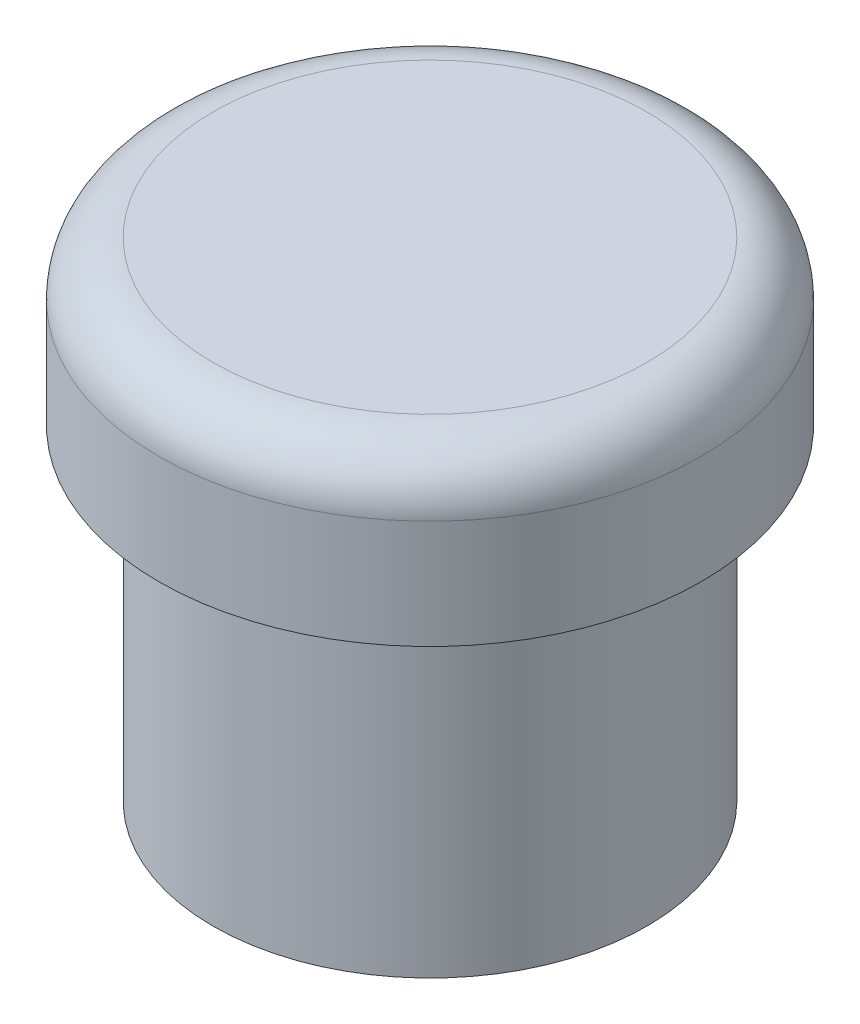
ISO-10303-21;
HEADER;
FILE_DESCRIPTION(('STEP AP214'),'2;1');
FILE_NAME('part.step','',(''),(''),'','','');
FILE_SCHEMA(('AUTOMOTIVE_DESIGN { 1 0 10303 214 1 1 1 1 }'));
ENDSEC;
DATA;
#1=APPLICATION_CONTEXT('core data for automotive mechanical design processes');
#2=APPLICATION_PROTOCOL_DEFINITION('international standard','automotive_design',2000,#1);
#3=PRODUCT_CONTEXT('',#1,'mechanical');
#4=PRODUCT('Part','Part','',(#3));
#5=PRODUCT_RELATED_PRODUCT_CATEGORY('part','',(#4));
#6=PRODUCT_DEFINITION_FORMATION('','',#4);
#7=PRODUCT_DEFINITION_CONTEXT('part definition',#1,'design');
#8=PRODUCT_DEFINITION('design','',#6,#7);
#9=PRODUCT_DEFINITION_SHAPE('','',#8);
#10=(LENGTH_UNIT() NAMED_UNIT(*) SI_UNIT(.MILLI.,.METRE.));
#11=(NAMED_UNIT(*) PLANE_ANGLE_UNIT() SI_UNIT($,.RADIAN.));
#12=(NAMED_UNIT(*) SI_UNIT($,.STERADIAN.) SOLID_ANGLE_UNIT());
#13=UNCERTAINTY_MEASURE_WITH_UNIT(LENGTH_MEASURE(1.E-05),#10,'distance_accuracy_value','');
#14=(GEOMETRIC_REPRESENTATION_CONTEXT(3) GLOBAL_UNCERTAINTY_ASSIGNED_CONTEXT((#13)) GLOBAL_UNIT_ASSIGNED_CONTEXT((#10,
#11,#12)) REPRESENTATION_CONTEXT('',''));
#15=CARTESIAN_POINT('',(0.,0.,0.));
#16=DIRECTION('',(0.,0.,1.));
#17=DIRECTION('',(1.,0.,0.));
#18=AXIS2_PLACEMENT_3D('',#15,#16,#17);
#19=CARTESIAN_POINT('',(0.,0.,0.));
#20=DIRECTION('',(0.,1.,0.));
#21=DIRECTION('',(0.,0.,1.));
#22=AXIS2_PLACEMENT_3D('',#19,#20,#21);
#23=PLANE('',#22);
#24=CARTESIAN_POINT('',(0.,0.,0.));
#25=DIRECTION('',(0.,1.,0.));
#26=DIRECTION('',(0.,0.,1.));
#27=AXIS2_PLACEMENT_3D('',#24,#25,#26);
#28=CIRCLE('',#27,2.);
#29=CARTESIAN_POINT('',(0.,0.,2.));
#30=VERTEX_POINT('',#29);
#31=EDGE_CURVE('E55',#30,#30,#28,.T.);
#32=ORIENTED_EDGE('',*,*,#31,.F.);
#33=EDGE_LOOP('',(#32));
#34=FACE_BOUND('',#33,.T.);
#35=CARTESIAN_POINT('',(0.,0.,0.));
#36=DIRECTION('',(0.,1.,0.));
#37=DIRECTION('',(0.,0.,1.));
#38=AXIS2_PLACEMENT_3D('',#35,#36,#37);
#39=CIRCLE('',#38,1.5875);
#40=CARTESIAN_POINT('',(0.,0.,1.5875));
#41=VERTEX_POINT('',#40);
#42=EDGE_CURVE('E60',#41,#41,#39,.T.);
#43=ORIENTED_EDGE('',*,*,#42,.T.);
#44=EDGE_LOOP('',(#43));
#45=FACE_BOUND('',#44,.T.);
#46=ADVANCED_FACE('F37',(#34,#45),#23,.F.);
#47=CARTESIAN_POINT('',(0.,3.,0.));
#48=DIRECTION('',(0.,-1.,0.));
#49=DIRECTION('',(0.,0.,-1.));
#50=AXIS2_PLACEMENT_3D('',#47,#48,#49);
#51=CYLINDRICAL_SURFACE('',#50,2.);
#52=CARTESIAN_POINT('',(0.,3.,0.));
#53=DIRECTION('',(0.,1.,0.));
#54=DIRECTION('',(0.,0.,1.));
#55=AXIS2_PLACEMENT_3D('',#52,#53,#54);
#56=CIRCLE('',#55,2.);
#57=CARTESIAN_POINT('',(0.,3.,2.));
#58=VERTEX_POINT('',#57);
#59=EDGE_CURVE('E50',#58,#58,#56,.T.);
#60=ORIENTED_EDGE('',*,*,#59,.F.);
#61=EDGE_LOOP('',(#60));
#62=FACE_BOUND('',#61,.T.);
#63=ORIENTED_EDGE('',*,*,#31,.T.);
#64=EDGE_LOOP('',(#63));
#65=FACE_BOUND('',#64,.T.);
#66=ADVANCED_FACE('F93',(#62,#65),#51,.T.);
#67=CARTESIAN_POINT('',(0.,3.,0.));
#68=DIRECTION('',(0.,-1.,0.));
#69=DIRECTION('',(0.,0.,-1.));
#70=AXIS2_PLACEMENT_3D('',#67,#68,#69);
#71=CYLINDRICAL_SURFACE('',#70,1.5875);
#72=CARTESIAN_POINT('',(0.,3.,0.));
#73=DIRECTION('',(0.,1.,0.));
#74=DIRECTION('',(0.,0.,1.));
#75=AXIS2_PLACEMENT_3D('',#72,#73,#74);
#76=CIRCLE('',#75,1.5875);
#77=CARTESIAN_POINT('',(0.,3.,1.5875));
#78=VERTEX_POINT('',#77);
#79=EDGE_CURVE('E65',#78,#78,#76,.T.);
#80=ORIENTED_EDGE('',*,*,#79,.T.);
#81=EDGE_LOOP('',(#80));
#82=FACE_BOUND('',#81,.T.);
#83=ORIENTED_EDGE('',*,*,#42,.F.);
#84=EDGE_LOOP('',(#83));
#85=FACE_BOUND('',#84,.T.);
#86=ADVANCED_FACE('F90',(#82,#85),#71,.F.);
#87=CARTESIAN_POINT('',(0.,3.,0.));
#88=DIRECTION('',(0.,1.,0.));
#89=DIRECTION('',(0.,0.,1.));
#90=AXIS2_PLACEMENT_3D('',#87,#88,#89);
#91=PLANE('',#90);
#92=ORIENTED_EDGE('',*,*,#79,.F.);
#93=EDGE_LOOP('',(#92));
#94=FACE_BOUND('',#93,.T.);
#95=ADVANCED_FACE('F81',(#94),#91,.F.);
#96=CARTESIAN_POINT('',(0.,4.5,0.));
#97=DIRECTION('',(0.,-1.,0.));
#98=DIRECTION('',(0.,0.,-1.));
#99=AXIS2_PLACEMENT_3D('',#96,#97,#98);
#100=CYLINDRICAL_SURFACE('',#99,2.5);
#101=CARTESIAN_POINT('',(0.,4.,0.));
#102=DIRECTION('',(0.,1.,0.));
#103=DIRECTION('',(0.,0.,1.));
#104=AXIS2_PLACEMENT_3D('',#101,#102,#103);
#105=CIRCLE('',#104,2.5);
#106=CARTESIAN_POINT('',(0.,4.,2.5));
#107=VERTEX_POINT('',#106);
#108=EDGE_CURVE('E10',#107,#107,#105,.F.);
#109=ORIENTED_EDGE('',*,*,#108,.T.);
#110=EDGE_LOOP('',(#109));
#111=FACE_BOUND('',#110,.T.);
#112=CARTESIAN_POINT('',(0.,3.,0.));
#113=DIRECTION('',(0.,1.,0.));
#114=DIRECTION('',(0.,0.,1.));
#115=AXIS2_PLACEMENT_3D('',#112,#113,#114);
#116=CIRCLE('',#115,2.5);
#117=CARTESIAN_POINT('',(0.,3.,2.5));
#118=VERTEX_POINT('',#117);
#119=EDGE_CURVE('E69',#118,#118,#116,.T.);
#120=ORIENTED_EDGE('',*,*,#119,.T.);
#121=EDGE_LOOP('',(#120));
#122=FACE_BOUND('',#121,.T.);
#123=ADVANCED_FACE('F74',(#111,#122),#100,.T.);
#124=CARTESIAN_POINT('',(0.,4.5,0.));
#125=DIRECTION('',(0.,1.,0.));
#126=DIRECTION('',(0.,0.,1.));
#127=AXIS2_PLACEMENT_3D('',#124,#125,#126);
#128=PLANE('',#127);
#129=CARTESIAN_POINT('',(0.,4.5,0.));
#130=DIRECTION('',(0.,1.,0.));
#131=DIRECTION('',(0.,0.,1.));
#132=AXIS2_PLACEMENT_3D('',#129,#130,#131);
#133=CIRCLE('',#132,2.);
#134=CARTESIAN_POINT('',(0.,4.5,2.));
#135=VERTEX_POINT('',#134);
#136=EDGE_CURVE('E45',#135,#135,#133,.T.);
#137=ORIENTED_EDGE('',*,*,#136,.T.);
#138=EDGE_LOOP('',(#137));
#139=FACE_BOUND('',#138,.T.);
#140=ADVANCED_FACE('F78',(#139),#128,.T.);
#141=ORIENTED_EDGE('',*,*,#59,.T.);
#142=EDGE_LOOP('',(#141));
#143=FACE_BOUND('',#142,.T.);
#144=ORIENTED_EDGE('',*,*,#119,.F.);
#145=EDGE_LOOP('',(#144));
#146=FACE_BOUND('',#145,.T.);
#147=ADVANCED_FACE('F76',(#143,#146),#91,.F.);
#148=CARTESIAN_POINT('',(0.,4.,0.));
#149=DIRECTION('',(0.,1.,0.));
#150=DIRECTION('',(0.,0.,1.));
#151=AXIS2_PLACEMENT_3D('',#148,#149,#150);
#152=TOROIDAL_SURFACE('',#151,2.,0.5);
#153=ORIENTED_EDGE('',*,*,#108,.F.);
#154=EDGE_LOOP('',(#153));
#155=FACE_BOUND('',#154,.T.);
#156=ORIENTED_EDGE('',*,*,#136,.F.);
#157=EDGE_LOOP('',(#156));
#158=FACE_BOUND('',#157,.T.);
#159=ADVANCED_FACE('F39',(#155,#158),#152,.T.);
#160=CLOSED_SHELL('',(#46,#66,#86,#95,#123,#140,#147,#159));
#161=MANIFOLD_SOLID_BREP('B2',#160);
#162=ADVANCED_BREP_SHAPE_REPRESENTATION('',(#18,#161),#14);
#163=SHAPE_DEFINITION_REPRESENTATION(#9,#162);
ENDSEC;
END-ISO-10303-21;
